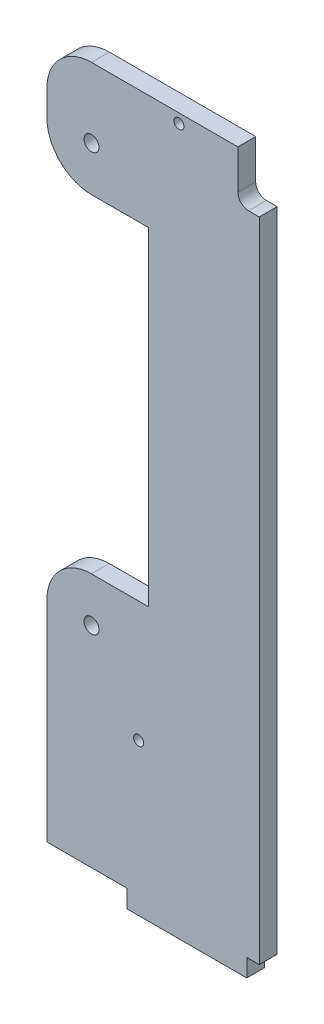
ISO-10303-21;
HEADER;
FILE_DESCRIPTION(('STEP AP214'),'2;1');
FILE_NAME('part.step','',(''),(''),'','','');
FILE_SCHEMA(('AUTOMOTIVE_DESIGN { 1 0 10303 214 1 1 1 1 }'));
ENDSEC;
DATA;
#1=APPLICATION_CONTEXT('core data for automotive mechanical design processes');
#2=APPLICATION_PROTOCOL_DEFINITION('international standard','automotive_design',2000,#1);
#3=PRODUCT_CONTEXT('',#1,'mechanical');
#4=PRODUCT('Part','Part','',(#3));
#5=PRODUCT_RELATED_PRODUCT_CATEGORY('part','',(#4));
#6=PRODUCT_DEFINITION_FORMATION('','',#4);
#7=PRODUCT_DEFINITION_CONTEXT('part definition',#1,'design');
#8=PRODUCT_DEFINITION('design','',#6,#7);
#9=PRODUCT_DEFINITION_SHAPE('','',#8);
#10=(LENGTH_UNIT() NAMED_UNIT(*) SI_UNIT(.MILLI.,.METRE.));
#11=(NAMED_UNIT(*) PLANE_ANGLE_UNIT() SI_UNIT($,.RADIAN.));
#12=(NAMED_UNIT(*) SI_UNIT($,.STERADIAN.) SOLID_ANGLE_UNIT());
#13=UNCERTAINTY_MEASURE_WITH_UNIT(LENGTH_MEASURE(1.E-05),#10,'distance_accuracy_value','');
#14=(GEOMETRIC_REPRESENTATION_CONTEXT(3) GLOBAL_UNCERTAINTY_ASSIGNED_CONTEXT((#13)) GLOBAL_UNIT_ASSIGNED_CONTEXT((#10,
#11,#12)) REPRESENTATION_CONTEXT('',''));
#15=CARTESIAN_POINT('',(0.,0.,0.));
#16=DIRECTION('',(0.,0.,1.));
#17=DIRECTION('',(1.,0.,0.));
#18=AXIS2_PLACEMENT_3D('',#15,#16,#17);
#19=CARTESIAN_POINT('',(44.,125.6,5.));
#20=DIRECTION('',(0.,0.,1.));
#21=DIRECTION('',(1.,0.,0.));
#22=AXIS2_PLACEMENT_3D('',#19,#20,#21);
#23=PLANE('',#22);
#24=CARTESIAN_POINT('',(24.5,134.,5.));
#25=DIRECTION('',(0.,0.,1.));
#26=DIRECTION('',(1.,0.,0.));
#27=AXIS2_PLACEMENT_3D('',#24,#25,#26);
#28=CIRCLE('',#27,1.40000000000001);
#29=CARTESIAN_POINT('',(25.9,134.,5.));
#30=VERTEX_POINT('',#29);
#31=EDGE_CURVE('E366',#30,#30,#28,.T.);
#32=ORIENTED_EDGE('',*,*,#31,.F.);
#33=EDGE_LOOP('',(#32));
#34=FACE_BOUND('',#33,.T.);
#35=CARTESIAN_POINT('',(13.2,-21.3,5.));
#36=DIRECTION('',(0.,0.,1.));
#37=DIRECTION('',(1.,0.,0.));
#38=AXIS2_PLACEMENT_3D('',#35,#36,#37);
#39=CIRCLE('',#38,1.4);
#40=CARTESIAN_POINT('',(14.6,-21.3,5.));
#41=VERTEX_POINT('',#40);
#42=EDGE_CURVE('E368',#41,#41,#39,.T.);
#43=ORIENTED_EDGE('',*,*,#42,.F.);
#44=EDGE_LOOP('',(#43));
#45=FACE_BOUND('',#44,.T.);
#46=CARTESIAN_POINT('',(0.,0.,5.));
#47=DIRECTION('',(0.,0.,1.));
#48=DIRECTION('',(1.,0.,0.));
#49=AXIS2_PLACEMENT_3D('',#46,#47,#48);
#50=CIRCLE('',#49,2.1);
#51=CARTESIAN_POINT('',(2.1,0.,5.));
#52=VERTEX_POINT('',#51);
#53=EDGE_CURVE('E197',#52,#52,#50,.T.);
#54=ORIENTED_EDGE('',*,*,#53,.F.);
#55=EDGE_LOOP('',(#54));
#56=FACE_BOUND('',#55,.T.);
#57=DIRECTION('',(1.,0.,0.));
#58=VECTOR('',#57,1.);
#59=CARTESIAN_POINT('',(43.5,-58.8,5.));
#60=LINE('',#59,#58);
#61=CARTESIAN_POINT('',(43.5,-58.8,5.));
#62=VERTEX_POINT('',#61);
#63=CARTESIAN_POINT('',(47.,-58.8,5.));
#64=VERTEX_POINT('',#63);
#65=EDGE_CURVE('E229',#62,#64,#60,.T.);
#66=ORIENTED_EDGE('',*,*,#65,.T.);
#67=DIRECTION('',(0.,1.,0.));
#68=VECTOR('',#67,1.);
#69=CARTESIAN_POINT('',(47.,-29.8,5.));
#70=LINE('',#69,#68);
#71=CARTESIAN_POINT('',(47.,122.6,5.));
#72=VERTEX_POINT('',#71);
#73=EDGE_CURVE('E126',#64,#72,#70,.T.);
#74=ORIENTED_EDGE('',*,*,#73,.T.);
#75=DIRECTION('',(-1.,0.,0.));
#76=VECTOR('',#75,1.);
#77=CARTESIAN_POINT('',(44.,122.6,5.));
#78=LINE('',#77,#76);
#79=CARTESIAN_POINT('',(44.,122.6,5.));
#80=VERTEX_POINT('',#79);
#81=EDGE_CURVE('E274',#72,#80,#78,.T.);
#82=ORIENTED_EDGE('',*,*,#81,.T.);
#83=CARTESIAN_POINT('',(44.,125.6,5.));
#84=DIRECTION('',(0.,0.,-1.));
#85=DIRECTION('',(1.,0.,0.));
#86=AXIS2_PLACEMENT_3D('',#83,#84,#85);
#87=CIRCLE('',#86,3.);
#88=CARTESIAN_POINT('',(41.,125.6,5.));
#89=VERTEX_POINT('',#88);
#90=EDGE_CURVE('E292',#80,#89,#87,.T.);
#91=ORIENTED_EDGE('',*,*,#90,.T.);
#92=DIRECTION('',(0.,1.,0.));
#93=VECTOR('',#92,1.);
#94=CARTESIAN_POINT('',(41.,136.6,5.));
#95=LINE('',#94,#93);
#96=CARTESIAN_POINT('',(41.,136.6,5.));
#97=VERTEX_POINT('',#96);
#98=EDGE_CURVE('E289',#89,#97,#95,.T.);
#99=ORIENTED_EDGE('',*,*,#98,.T.);
#100=DIRECTION('',(-1.,0.,0.));
#101=VECTOR('',#100,1.);
#102=CARTESIAN_POINT('',(41.,136.6,5.));
#103=LINE('',#102,#101);
#104=CARTESIAN_POINT('',(0.,136.6,5.));
#105=VERTEX_POINT('',#104);
#106=EDGE_CURVE('E291',#97,#105,#103,.T.);
#107=ORIENTED_EDGE('',*,*,#106,.T.);
#108=CARTESIAN_POINT('',(0.,124.1,5.));
#109=DIRECTION('',(0.,0.,1.));
#110=DIRECTION('',(1.,0.,0.));
#111=AXIS2_PLACEMENT_3D('',#108,#109,#110);
#112=CIRCLE('',#111,12.5);
#113=CARTESIAN_POINT('',(-12.5,124.1,5.));
#114=VERTEX_POINT('',#113);
#115=EDGE_CURVE('E294',#105,#114,#112,.T.);
#116=ORIENTED_EDGE('',*,*,#115,.T.);
#117=DIRECTION('',(0.,-1.,0.));
#118=VECTOR('',#117,1.);
#119=CARTESIAN_POINT('',(-12.5,124.1,5.));
#120=LINE('',#119,#118);
#121=CARTESIAN_POINT('',(-12.5,117.,5.));
#122=VERTEX_POINT('',#121);
#123=EDGE_CURVE('E300',#114,#122,#120,.T.);
#124=ORIENTED_EDGE('',*,*,#123,.T.);
#125=CARTESIAN_POINT('',(0.,117.,5.));
#126=DIRECTION('',(0.,0.,1.));
#127=DIRECTION('',(1.,0.,0.));
#128=AXIS2_PLACEMENT_3D('',#125,#126,#127);
#129=CIRCLE('',#128,12.5);
#130=CARTESIAN_POINT('',(0.,104.5,5.));
#131=VERTEX_POINT('',#130);
#132=EDGE_CURVE('E302',#122,#131,#129,.T.);
#133=ORIENTED_EDGE('',*,*,#132,.T.);
#134=DIRECTION('',(1.,0.,0.));
#135=VECTOR('',#134,1.);
#136=CARTESIAN_POINT('',(16.,104.5,5.));
#137=LINE('',#136,#135);
#138=CARTESIAN_POINT('',(16.,104.5,5.));
#139=VERTEX_POINT('',#138);
#140=EDGE_CURVE('E304',#131,#139,#137,.T.);
#141=ORIENTED_EDGE('',*,*,#140,.T.);
#142=DIRECTION('',(0.,-1.,0.));
#143=VECTOR('',#142,1.);
#144=CARTESIAN_POINT('',(16.,12.5,5.));
#145=LINE('',#144,#143);
#146=CARTESIAN_POINT('',(16.,12.5,5.));
#147=VERTEX_POINT('',#146);
#148=EDGE_CURVE('E306',#139,#147,#145,.T.);
#149=ORIENTED_EDGE('',*,*,#148,.T.);
#150=DIRECTION('',(-1.,0.,0.));
#151=VECTOR('',#150,1.);
#152=CARTESIAN_POINT('',(0.,12.5,5.));
#153=LINE('',#152,#151);
#154=CARTESIAN_POINT('',(0.,12.5,5.));
#155=VERTEX_POINT('',#154);
#156=EDGE_CURVE('E308',#147,#155,#153,.T.);
#157=ORIENTED_EDGE('',*,*,#156,.T.);
#158=CARTESIAN_POINT('',(0.,0.,5.));
#159=DIRECTION('',(0.,0.,1.));
#160=DIRECTION('',(1.,0.,0.));
#161=AXIS2_PLACEMENT_3D('',#158,#159,#160);
#162=CIRCLE('',#161,12.5);
#163=CARTESIAN_POINT('',(-12.5,0.,5.));
#164=VERTEX_POINT('',#163);
#165=EDGE_CURVE('E310',#155,#164,#162,.T.);
#166=ORIENTED_EDGE('',*,*,#165,.T.);
#167=DIRECTION('',(0.,-1.,0.));
#168=VECTOR('',#167,1.);
#169=CARTESIAN_POINT('',(-12.5,-58.8,5.));
#170=LINE('',#169,#168);
#171=CARTESIAN_POINT('',(-12.5,-58.8,5.));
#172=VERTEX_POINT('',#171);
#173=EDGE_CURVE('E312',#164,#172,#170,.T.);
#174=ORIENTED_EDGE('',*,*,#173,.T.);
#175=DIRECTION('',(1.,0.,0.));
#176=VECTOR('',#175,1.);
#177=CARTESIAN_POINT('',(10.,-58.8,5.));
#178=LINE('',#177,#176);
#179=CARTESIAN_POINT('',(10.,-58.8,5.));
#180=VERTEX_POINT('',#179);
#181=EDGE_CURVE('E175',#172,#180,#178,.T.);
#182=ORIENTED_EDGE('',*,*,#181,.T.);
#183=DIRECTION('',(0.,-1.,0.));
#184=VECTOR('',#183,1.);
#185=CARTESIAN_POINT('',(10.,-63.8,5.));
#186=LINE('',#185,#184);
#187=CARTESIAN_POINT('',(10.,-63.8,5.));
#188=VERTEX_POINT('',#187);
#189=EDGE_CURVE('E169',#180,#188,#186,.T.);
#190=ORIENTED_EDGE('',*,*,#189,.T.);
#191=DIRECTION('',(1.,0.,0.));
#192=VECTOR('',#191,1.);
#193=CARTESIAN_POINT('',(43.5,-63.8,5.));
#194=LINE('',#193,#192);
#195=CARTESIAN_POINT('',(43.5,-63.8,5.));
#196=VERTEX_POINT('',#195);
#197=EDGE_CURVE('E173',#188,#196,#194,.T.);
#198=ORIENTED_EDGE('',*,*,#197,.T.);
#199=DIRECTION('',(0.,1.,0.));
#200=VECTOR('',#199,1.);
#201=CARTESIAN_POINT('',(43.5,-58.8,5.));
#202=LINE('',#201,#200);
#203=EDGE_CURVE('E53',#196,#62,#202,.T.);
#204=ORIENTED_EDGE('',*,*,#203,.T.);
#205=EDGE_LOOP('',(#66,#74,#82,#91,#99,#107,#116,#124,#133,#141,#149,#157,#166,#174,#182,#190,
#198,#204));
#206=FACE_BOUND('',#205,.T.);
#207=CARTESIAN_POINT('',(0.,117.,5.));
#208=DIRECTION('',(0.,0.,1.));
#209=DIRECTION('',(1.,0.,0.));
#210=AXIS2_PLACEMENT_3D('',#207,#208,#209);
#211=CIRCLE('',#210,2.1);
#212=CARTESIAN_POINT('',(2.1,117.,5.));
#213=VERTEX_POINT('',#212);
#214=EDGE_CURVE('E377',#213,#213,#211,.T.);
#215=ORIENTED_EDGE('',*,*,#214,.F.);
#216=EDGE_LOOP('',(#215));
#217=FACE_BOUND('',#216,.T.);
#218=ADVANCED_FACE('F36',(#34,#45,#56,#206,#217),#23,.T.);
#219=CARTESIAN_POINT('',(44.,125.6,0.));
#220=DIRECTION('',(0.,0.,1.));
#221=DIRECTION('',(1.,0.,0.));
#222=AXIS2_PLACEMENT_3D('',#219,#220,#221);
#223=PLANE('',#222);
#224=CARTESIAN_POINT('',(24.5,134.,0.));
#225=DIRECTION('',(0.,0.,1.));
#226=DIRECTION('',(1.,0.,0.));
#227=AXIS2_PLACEMENT_3D('',#224,#225,#226);
#228=CIRCLE('',#227,1.40000000000001);
#229=CARTESIAN_POINT('',(25.9,134.,0.));
#230=VERTEX_POINT('',#229);
#231=EDGE_CURVE('E364',#230,#230,#228,.T.);
#232=ORIENTED_EDGE('',*,*,#231,.T.);
#233=EDGE_LOOP('',(#232));
#234=FACE_BOUND('',#233,.T.);
#235=CARTESIAN_POINT('',(13.2,-21.3,0.));
#236=DIRECTION('',(0.,0.,1.));
#237=DIRECTION('',(1.,0.,0.));
#238=AXIS2_PLACEMENT_3D('',#235,#236,#237);
#239=CIRCLE('',#238,1.4);
#240=CARTESIAN_POINT('',(14.6,-21.3,0.));
#241=VERTEX_POINT('',#240);
#242=EDGE_CURVE('E371',#241,#241,#239,.T.);
#243=ORIENTED_EDGE('',*,*,#242,.T.);
#244=EDGE_LOOP('',(#243));
#245=FACE_BOUND('',#244,.T.);
#246=DIRECTION('',(1.,0.,0.));
#247=VECTOR('',#246,1.);
#248=CARTESIAN_POINT('',(43.5,-58.8,0.));
#249=LINE('',#248,#247);
#250=CARTESIAN_POINT('',(43.5,-58.8,0.));
#251=VERTEX_POINT('',#250);
#252=CARTESIAN_POINT('',(47.,-58.8,0.));
#253=VERTEX_POINT('',#252);
#254=EDGE_CURVE('E193',#251,#253,#249,.T.);
#255=ORIENTED_EDGE('',*,*,#254,.F.);
#256=DIRECTION('',(0.,1.,0.));
#257=VECTOR('',#256,1.);
#258=CARTESIAN_POINT('',(43.5,-58.8,0.));
#259=LINE('',#258,#257);
#260=CARTESIAN_POINT('',(43.5,-63.8,0.));
#261=VERTEX_POINT('',#260);
#262=EDGE_CURVE('E118',#261,#251,#259,.T.);
#263=ORIENTED_EDGE('',*,*,#262,.F.);
#264=DIRECTION('',(1.,0.,0.));
#265=VECTOR('',#264,1.);
#266=CARTESIAN_POINT('',(43.5,-63.8,0.));
#267=LINE('',#266,#265);
#268=CARTESIAN_POINT('',(10.,-63.8,0.));
#269=VERTEX_POINT('',#268);
#270=EDGE_CURVE('E112',#269,#261,#267,.T.);
#271=ORIENTED_EDGE('',*,*,#270,.F.);
#272=DIRECTION('',(0.,-1.,0.));
#273=VECTOR('',#272,1.);
#274=CARTESIAN_POINT('',(10.,-63.8,0.));
#275=LINE('',#274,#273);
#276=CARTESIAN_POINT('',(10.,-58.8,0.));
#277=VERTEX_POINT('',#276);
#278=EDGE_CURVE('E183',#277,#269,#275,.T.);
#279=ORIENTED_EDGE('',*,*,#278,.F.);
#280=DIRECTION('',(1.,0.,0.));
#281=VECTOR('',#280,1.);
#282=CARTESIAN_POINT('',(10.,-58.8,0.));
#283=LINE('',#282,#281);
#284=CARTESIAN_POINT('',(-12.5,-58.8,0.));
#285=VERTEX_POINT('',#284);
#286=EDGE_CURVE('E224',#285,#277,#283,.T.);
#287=ORIENTED_EDGE('',*,*,#286,.F.);
#288=DIRECTION('',(0.,-1.,0.));
#289=VECTOR('',#288,1.);
#290=CARTESIAN_POINT('',(-12.5,-58.8,0.));
#291=LINE('',#290,#289);
#292=CARTESIAN_POINT('',(-12.5,0.,0.));
#293=VERTEX_POINT('',#292);
#294=EDGE_CURVE('E222',#293,#285,#291,.T.);
#295=ORIENTED_EDGE('',*,*,#294,.F.);
#296=CARTESIAN_POINT('',(0.,0.,0.));
#297=DIRECTION('',(0.,0.,1.));
#298=DIRECTION('',(1.,0.,0.));
#299=AXIS2_PLACEMENT_3D('',#296,#297,#298);
#300=CIRCLE('',#299,12.5);
#301=CARTESIAN_POINT('',(0.,12.5,0.));
#302=VERTEX_POINT('',#301);
#303=EDGE_CURVE('E220',#302,#293,#300,.T.);
#304=ORIENTED_EDGE('',*,*,#303,.F.);
#305=DIRECTION('',(-1.,0.,0.));
#306=VECTOR('',#305,1.);
#307=CARTESIAN_POINT('',(0.,12.5,0.));
#308=LINE('',#307,#306);
#309=CARTESIAN_POINT('',(16.,12.5,0.));
#310=VERTEX_POINT('',#309);
#311=EDGE_CURVE('E218',#310,#302,#308,.T.);
#312=ORIENTED_EDGE('',*,*,#311,.F.);
#313=DIRECTION('',(0.,-1.,0.));
#314=VECTOR('',#313,1.);
#315=CARTESIAN_POINT('',(16.,12.5,0.));
#316=LINE('',#315,#314);
#317=CARTESIAN_POINT('',(16.,104.5,0.));
#318=VERTEX_POINT('',#317);
#319=EDGE_CURVE('E216',#318,#310,#316,.T.);
#320=ORIENTED_EDGE('',*,*,#319,.F.);
#321=DIRECTION('',(1.,0.,0.));
#322=VECTOR('',#321,1.);
#323=CARTESIAN_POINT('',(16.,104.5,0.));
#324=LINE('',#323,#322);
#325=CARTESIAN_POINT('',(0.,104.5,0.));
#326=VERTEX_POINT('',#325);
#327=EDGE_CURVE('E214',#326,#318,#324,.T.);
#328=ORIENTED_EDGE('',*,*,#327,.F.);
#329=CARTESIAN_POINT('',(0.,117.,0.));
#330=DIRECTION('',(0.,0.,1.));
#331=DIRECTION('',(1.,0.,0.));
#332=AXIS2_PLACEMENT_3D('',#329,#330,#331);
#333=CIRCLE('',#332,12.5);
#334=CARTESIAN_POINT('',(-12.5,117.,0.));
#335=VERTEX_POINT('',#334);
#336=EDGE_CURVE('E212',#335,#326,#333,.T.);
#337=ORIENTED_EDGE('',*,*,#336,.F.);
#338=DIRECTION('',(0.,-1.,0.));
#339=VECTOR('',#338,1.);
#340=CARTESIAN_POINT('',(-12.5,124.1,0.));
#341=LINE('',#340,#339);
#342=CARTESIAN_POINT('',(-12.5,124.1,0.));
#343=VERTEX_POINT('',#342);
#344=EDGE_CURVE('E210',#343,#335,#341,.T.);
#345=ORIENTED_EDGE('',*,*,#344,.F.);
#346=CARTESIAN_POINT('',(0.,124.1,0.));
#347=DIRECTION('',(0.,0.,1.));
#348=DIRECTION('',(1.,0.,0.));
#349=AXIS2_PLACEMENT_3D('',#346,#347,#348);
#350=CIRCLE('',#349,12.5);
#351=CARTESIAN_POINT('',(0.,136.6,0.));
#352=VERTEX_POINT('',#351);
#353=EDGE_CURVE('E208',#352,#343,#350,.T.);
#354=ORIENTED_EDGE('',*,*,#353,.F.);
#355=DIRECTION('',(-1.,0.,0.));
#356=VECTOR('',#355,1.);
#357=CARTESIAN_POINT('',(0.,136.6,0.));
#358=LINE('',#357,#356);
#359=CARTESIAN_POINT('',(41.,136.6,0.));
#360=VERTEX_POINT('',#359);
#361=EDGE_CURVE('E206',#360,#352,#358,.T.);
#362=ORIENTED_EDGE('',*,*,#361,.F.);
#363=DIRECTION('',(0.,1.,0.));
#364=VECTOR('',#363,1.);
#365=CARTESIAN_POINT('',(41.,136.6,0.));
#366=LINE('',#365,#364);
#367=CARTESIAN_POINT('',(41.,125.6,0.));
#368=VERTEX_POINT('',#367);
#369=EDGE_CURVE('E203',#368,#360,#366,.T.);
#370=ORIENTED_EDGE('',*,*,#369,.F.);
#371=CARTESIAN_POINT('',(44.,125.6,0.));
#372=DIRECTION('',(0.,0.,-1.));
#373=DIRECTION('',(1.,0.,0.));
#374=AXIS2_PLACEMENT_3D('',#371,#372,#373);
#375=CIRCLE('',#374,3.);
#376=CARTESIAN_POINT('',(44.,122.6,0.));
#377=VERTEX_POINT('',#376);
#378=EDGE_CURVE('E201',#377,#368,#375,.T.);
#379=ORIENTED_EDGE('',*,*,#378,.F.);
#380=DIRECTION('',(-1.,0.,0.));
#381=VECTOR('',#380,1.);
#382=CARTESIAN_POINT('',(44.,122.6,0.));
#383=LINE('',#382,#381);
#384=CARTESIAN_POINT('',(47.,122.6,0.));
#385=VERTEX_POINT('',#384);
#386=EDGE_CURVE('E199',#385,#377,#383,.T.);
#387=ORIENTED_EDGE('',*,*,#386,.F.);
#388=DIRECTION('',(0.,1.,0.));
#389=VECTOR('',#388,1.);
#390=CARTESIAN_POINT('',(47.,122.6,0.));
#391=LINE('',#390,#389);
#392=EDGE_CURVE('E196',#253,#385,#391,.T.);
#393=ORIENTED_EDGE('',*,*,#392,.F.);
#394=EDGE_LOOP('',(#255,#263,#271,#279,#287,#295,#304,#312,#320,#328,#337,#345,#354,#362,#370,
#379,#387,#393));
#395=FACE_BOUND('',#394,.T.);
#396=CARTESIAN_POINT('',(0.,0.,0.));
#397=DIRECTION('',(0.,0.,1.));
#398=DIRECTION('',(1.,0.,0.));
#399=AXIS2_PLACEMENT_3D('',#396,#397,#398);
#400=CIRCLE('',#399,2.1);
#401=CARTESIAN_POINT('',(2.1,0.,0.));
#402=VERTEX_POINT('',#401);
#403=EDGE_CURVE('E380',#402,#402,#400,.T.);
#404=ORIENTED_EDGE('',*,*,#403,.T.);
#405=EDGE_LOOP('',(#404));
#406=FACE_BOUND('',#405,.T.);
#407=CARTESIAN_POINT('',(0.,117.,0.));
#408=DIRECTION('',(0.,0.,1.));
#409=DIRECTION('',(1.,0.,0.));
#410=AXIS2_PLACEMENT_3D('',#407,#408,#409);
#411=CIRCLE('',#410,2.1);
#412=CARTESIAN_POINT('',(2.1,117.,0.));
#413=VERTEX_POINT('',#412);
#414=EDGE_CURVE('E374',#413,#413,#411,.T.);
#415=ORIENTED_EDGE('',*,*,#414,.T.);
#416=EDGE_LOOP('',(#415));
#417=FACE_BOUND('',#416,.T.);
#418=ADVANCED_FACE('F278',(#234,#245,#395,#406,#417),#223,.F.);
#419=CARTESIAN_POINT('',(43.5,-58.8,5.));
#420=DIRECTION('',(0.,1.,0.));
#421=DIRECTION('',(0.,0.,1.));
#422=AXIS2_PLACEMENT_3D('',#419,#420,#421);
#423=PLANE('',#422);
#424=ORIENTED_EDGE('',*,*,#254,.T.);
#425=DIRECTION('',(0.,0.,-1.));
#426=VECTOR('',#425,1.);
#427=CARTESIAN_POINT('',(47.,-58.8,5.));
#428=LINE('',#427,#426);
#429=EDGE_CURVE('E11',#64,#253,#428,.T.);
#430=ORIENTED_EDGE('',*,*,#429,.F.);
#431=ORIENTED_EDGE('',*,*,#65,.F.);
#432=DIRECTION('',(0.,0.,-1.));
#433=VECTOR('',#432,1.);
#434=CARTESIAN_POINT('',(43.5,-58.8,5.));
#435=LINE('',#434,#433);
#436=EDGE_CURVE('E189',#62,#251,#435,.T.);
#437=ORIENTED_EDGE('',*,*,#436,.T.);
#438=EDGE_LOOP('',(#424,#430,#431,#437));
#439=FACE_BOUND('',#438,.T.);
#440=ADVANCED_FACE('F38',(#439),#423,.F.);
#441=CARTESIAN_POINT('',(47.,122.6,5.));
#442=DIRECTION('',(-1.,0.,0.));
#443=DIRECTION('',(0.,-1.,0.));
#444=AXIS2_PLACEMENT_3D('',#441,#442,#443);
#445=PLANE('',#444);
#446=ORIENTED_EDGE('',*,*,#392,.T.);
#447=DIRECTION('',(0.,0.,-1.));
#448=VECTOR('',#447,1.);
#449=CARTESIAN_POINT('',(47.,122.6,5.));
#450=LINE('',#449,#448);
#451=EDGE_CURVE('E45',#72,#385,#450,.T.);
#452=ORIENTED_EDGE('',*,*,#451,.F.);
#453=ORIENTED_EDGE('',*,*,#73,.F.);
#454=ORIENTED_EDGE('',*,*,#429,.T.);
#455=EDGE_LOOP('',(#446,#452,#453,#454));
#456=FACE_BOUND('',#455,.T.);
#457=ADVANCED_FACE('F553',(#456),#445,.F.);
#458=CARTESIAN_POINT('',(44.,122.6,5.));
#459=DIRECTION('',(0.,-1.,0.));
#460=DIRECTION('',(1.,0.,0.));
#461=AXIS2_PLACEMENT_3D('',#458,#459,#460);
#462=PLANE('',#461);
#463=ORIENTED_EDGE('',*,*,#386,.T.);
#464=DIRECTION('',(0.,0.,-1.));
#465=VECTOR('',#464,1.);
#466=CARTESIAN_POINT('',(44.,122.6,5.));
#467=LINE('',#466,#465);
#468=EDGE_CURVE('E266',#80,#377,#467,.T.);
#469=ORIENTED_EDGE('',*,*,#468,.F.);
#470=ORIENTED_EDGE('',*,*,#81,.F.);
#471=ORIENTED_EDGE('',*,*,#451,.T.);
#472=EDGE_LOOP('',(#463,#469,#470,#471));
#473=FACE_BOUND('',#472,.T.);
#474=ADVANCED_FACE('F272',(#473),#462,.F.);
#475=CARTESIAN_POINT('',(44.,125.6,5.));
#476=DIRECTION('',(0.,0.,-1.));
#477=DIRECTION('',(-1.,0.,0.));
#478=AXIS2_PLACEMENT_3D('',#475,#476,#477);
#479=CYLINDRICAL_SURFACE('',#478,3.);
#480=ORIENTED_EDGE('',*,*,#378,.T.);
#481=DIRECTION('',(0.,0.,-1.));
#482=VECTOR('',#481,1.);
#483=CARTESIAN_POINT('',(41.,125.6,5.));
#484=LINE('',#483,#482);
#485=EDGE_CURVE('E263',#89,#368,#484,.T.);
#486=ORIENTED_EDGE('',*,*,#485,.F.);
#487=ORIENTED_EDGE('',*,*,#90,.F.);
#488=ORIENTED_EDGE('',*,*,#468,.T.);
#489=EDGE_LOOP('',(#480,#486,#487,#488));
#490=FACE_BOUND('',#489,.T.);
#491=ADVANCED_FACE('F283',(#490),#479,.F.);
#492=CARTESIAN_POINT('',(41.,136.6,5.));
#493=DIRECTION('',(-1.,0.,0.));
#494=DIRECTION('',(0.,0.,1.));
#495=AXIS2_PLACEMENT_3D('',#492,#493,#494);
#496=PLANE('',#495);
#497=ORIENTED_EDGE('',*,*,#369,.T.);
#498=DIRECTION('',(0.,0.,-1.));
#499=VECTOR('',#498,1.);
#500=CARTESIAN_POINT('',(41.,136.6,5.));
#501=LINE('',#500,#499);
#502=EDGE_CURVE('E260',#97,#360,#501,.T.);
#503=ORIENTED_EDGE('',*,*,#502,.F.);
#504=ORIENTED_EDGE('',*,*,#98,.F.);
#505=ORIENTED_EDGE('',*,*,#485,.T.);
#506=EDGE_LOOP('',(#497,#503,#504,#505));
#507=FACE_BOUND('',#506,.T.);
#508=ADVANCED_FACE('F287',(#507),#496,.F.);
#509=CARTESIAN_POINT('',(0.,136.6,5.));
#510=DIRECTION('',(0.,-1.,0.));
#511=DIRECTION('',(0.,0.,-1.));
#512=AXIS2_PLACEMENT_3D('',#509,#510,#511);
#513=PLANE('',#512);
#514=ORIENTED_EDGE('',*,*,#361,.T.);
#515=DIRECTION('',(0.,0.,-1.));
#516=VECTOR('',#515,1.);
#517=CARTESIAN_POINT('',(0.,136.6,5.));
#518=LINE('',#517,#516);
#519=EDGE_CURVE('E257',#105,#352,#518,.T.);
#520=ORIENTED_EDGE('',*,*,#519,.F.);
#521=ORIENTED_EDGE('',*,*,#106,.F.);
#522=ORIENTED_EDGE('',*,*,#502,.T.);
#523=EDGE_LOOP('',(#514,#520,#521,#522));
#524=FACE_BOUND('',#523,.T.);
#525=ADVANCED_FACE('F517',(#524),#513,.F.);
#526=CARTESIAN_POINT('',(0.,124.1,5.));
#527=DIRECTION('',(0.,0.,-1.));
#528=DIRECTION('',(-1.,0.,0.));
#529=AXIS2_PLACEMENT_3D('',#526,#527,#528);
#530=CYLINDRICAL_SURFACE('',#529,12.5);
#531=ORIENTED_EDGE('',*,*,#353,.T.);
#532=DIRECTION('',(0.,0.,-1.));
#533=VECTOR('',#532,1.);
#534=CARTESIAN_POINT('',(-12.5,124.1,5.));
#535=LINE('',#534,#533);
#536=EDGE_CURVE('E254',#114,#343,#535,.T.);
#537=ORIENTED_EDGE('',*,*,#536,.F.);
#538=ORIENTED_EDGE('',*,*,#115,.F.);
#539=ORIENTED_EDGE('',*,*,#519,.T.);
#540=EDGE_LOOP('',(#531,#537,#538,#539));
#541=FACE_BOUND('',#540,.T.);
#542=ADVANCED_FACE('F507',(#541),#530,.T.);
#543=CARTESIAN_POINT('',(-12.5,124.1,5.));
#544=DIRECTION('',(1.,0.,0.));
#545=DIRECTION('',(0.,1.,0.));
#546=AXIS2_PLACEMENT_3D('',#543,#544,#545);
#547=PLANE('',#546);
#548=ORIENTED_EDGE('',*,*,#344,.T.);
#549=DIRECTION('',(0.,0.,-1.));
#550=VECTOR('',#549,1.);
#551=CARTESIAN_POINT('',(-12.5,117.,5.));
#552=LINE('',#551,#550);
#553=EDGE_CURVE('E251',#122,#335,#552,.T.);
#554=ORIENTED_EDGE('',*,*,#553,.F.);
#555=ORIENTED_EDGE('',*,*,#123,.F.);
#556=ORIENTED_EDGE('',*,*,#536,.T.);
#557=EDGE_LOOP('',(#548,#554,#555,#556));
#558=FACE_BOUND('',#557,.T.);
#559=ADVANCED_FACE('F497',(#558),#547,.F.);
#560=CARTESIAN_POINT('',(0.,117.,5.));
#561=DIRECTION('',(0.,0.,-1.));
#562=DIRECTION('',(-1.,0.,0.));
#563=AXIS2_PLACEMENT_3D('',#560,#561,#562);
#564=CYLINDRICAL_SURFACE('',#563,12.5);
#565=ORIENTED_EDGE('',*,*,#336,.T.);
#566=DIRECTION('',(0.,0.,-1.));
#567=VECTOR('',#566,1.);
#568=CARTESIAN_POINT('',(0.,104.5,5.));
#569=LINE('',#568,#567);
#570=EDGE_CURVE('E248',#131,#326,#569,.T.);
#571=ORIENTED_EDGE('',*,*,#570,.F.);
#572=ORIENTED_EDGE('',*,*,#132,.F.);
#573=ORIENTED_EDGE('',*,*,#553,.T.);
#574=EDGE_LOOP('',(#565,#571,#572,#573));
#575=FACE_BOUND('',#574,.T.);
#576=ADVANCED_FACE('F487',(#575),#564,.T.);
#577=CARTESIAN_POINT('',(16.,104.5,5.));
#578=DIRECTION('',(0.,1.,0.));
#579=DIRECTION('',(-1.,0.,0.));
#580=AXIS2_PLACEMENT_3D('',#577,#578,#579);
#581=PLANE('',#580);
#582=ORIENTED_EDGE('',*,*,#327,.T.);
#583=DIRECTION('',(0.,0.,-1.));
#584=VECTOR('',#583,1.);
#585=CARTESIAN_POINT('',(16.,104.5,5.));
#586=LINE('',#585,#584);
#587=EDGE_CURVE('E245',#139,#318,#586,.T.);
#588=ORIENTED_EDGE('',*,*,#587,.F.);
#589=ORIENTED_EDGE('',*,*,#140,.F.);
#590=ORIENTED_EDGE('',*,*,#570,.T.);
#591=EDGE_LOOP('',(#582,#588,#589,#590));
#592=FACE_BOUND('',#591,.T.);
#593=ADVANCED_FACE('F477',(#592),#581,.F.);
#594=CARTESIAN_POINT('',(16.,12.5,5.));
#595=DIRECTION('',(1.,0.,0.));
#596=DIRECTION('',(0.,0.,-1.));
#597=AXIS2_PLACEMENT_3D('',#594,#595,#596);
#598=PLANE('',#597);
#599=ORIENTED_EDGE('',*,*,#319,.T.);
#600=DIRECTION('',(0.,0.,-1.));
#601=VECTOR('',#600,1.);
#602=CARTESIAN_POINT('',(16.,12.5,5.));
#603=LINE('',#602,#601);
#604=EDGE_CURVE('E242',#147,#310,#603,.T.);
#605=ORIENTED_EDGE('',*,*,#604,.F.);
#606=ORIENTED_EDGE('',*,*,#148,.F.);
#607=ORIENTED_EDGE('',*,*,#587,.T.);
#608=EDGE_LOOP('',(#599,#605,#606,#607));
#609=FACE_BOUND('',#608,.T.);
#610=ADVANCED_FACE('F467',(#609),#598,.F.);
#611=CARTESIAN_POINT('',(0.,12.5,5.));
#612=DIRECTION('',(0.,-1.,0.));
#613=DIRECTION('',(1.,0.,0.));
#614=AXIS2_PLACEMENT_3D('',#611,#612,#613);
#615=PLANE('',#614);
#616=ORIENTED_EDGE('',*,*,#311,.T.);
#617=DIRECTION('',(0.,0.,-1.));
#618=VECTOR('',#617,1.);
#619=CARTESIAN_POINT('',(0.,12.5,5.));
#620=LINE('',#619,#618);
#621=EDGE_CURVE('E239',#155,#302,#620,.T.);
#622=ORIENTED_EDGE('',*,*,#621,.F.);
#623=ORIENTED_EDGE('',*,*,#156,.F.);
#624=ORIENTED_EDGE('',*,*,#604,.T.);
#625=EDGE_LOOP('',(#616,#622,#623,#624));
#626=FACE_BOUND('',#625,.T.);
#627=ADVANCED_FACE('F457',(#626),#615,.F.);
#628=CARTESIAN_POINT('',(0.,0.,5.));
#629=DIRECTION('',(0.,0.,-1.));
#630=DIRECTION('',(-1.,0.,0.));
#631=AXIS2_PLACEMENT_3D('',#628,#629,#630);
#632=CYLINDRICAL_SURFACE('',#631,12.5);
#633=ORIENTED_EDGE('',*,*,#303,.T.);
#634=DIRECTION('',(0.,0.,-1.));
#635=VECTOR('',#634,1.);
#636=CARTESIAN_POINT('',(-12.5,0.,5.));
#637=LINE('',#636,#635);
#638=EDGE_CURVE('E236',#164,#293,#637,.T.);
#639=ORIENTED_EDGE('',*,*,#638,.F.);
#640=ORIENTED_EDGE('',*,*,#165,.F.);
#641=ORIENTED_EDGE('',*,*,#621,.T.);
#642=EDGE_LOOP('',(#633,#639,#640,#641));
#643=FACE_BOUND('',#642,.T.);
#644=ADVANCED_FACE('F448',(#643),#632,.T.);
#645=CARTESIAN_POINT('',(-12.5,-58.8,5.));
#646=DIRECTION('',(1.,0.,0.));
#647=DIRECTION('',(0.,1.,0.));
#648=AXIS2_PLACEMENT_3D('',#645,#646,#647);
#649=PLANE('',#648);
#650=ORIENTED_EDGE('',*,*,#294,.T.);
#651=DIRECTION('',(0.,0.,-1.));
#652=VECTOR('',#651,1.);
#653=CARTESIAN_POINT('',(-12.5,-58.8,5.));
#654=LINE('',#653,#652);
#655=EDGE_CURVE('E233',#172,#285,#654,.T.);
#656=ORIENTED_EDGE('',*,*,#655,.F.);
#657=ORIENTED_EDGE('',*,*,#173,.F.);
#658=ORIENTED_EDGE('',*,*,#638,.T.);
#659=EDGE_LOOP('',(#650,#656,#657,#658));
#660=FACE_BOUND('',#659,.T.);
#661=ADVANCED_FACE('F318',(#660),#649,.F.);
#662=CARTESIAN_POINT('',(10.,-58.8,5.));
#663=DIRECTION('',(0.,1.,0.));
#664=DIRECTION('',(0.,0.,1.));
#665=AXIS2_PLACEMENT_3D('',#662,#663,#664);
#666=PLANE('',#665);
#667=ORIENTED_EDGE('',*,*,#286,.T.);
#668=DIRECTION('',(0.,0.,-1.));
#669=VECTOR('',#668,1.);
#670=CARTESIAN_POINT('',(10.,-58.8,5.));
#671=LINE('',#670,#669);
#672=EDGE_CURVE('E184',#180,#277,#671,.T.);
#673=ORIENTED_EDGE('',*,*,#672,.F.);
#674=ORIENTED_EDGE('',*,*,#181,.F.);
#675=ORIENTED_EDGE('',*,*,#655,.T.);
#676=EDGE_LOOP('',(#667,#673,#674,#675));
#677=FACE_BOUND('',#676,.T.);
#678=ADVANCED_FACE('F322',(#677),#666,.F.);
#679=CARTESIAN_POINT('',(10.,-63.8,5.));
#680=DIRECTION('',(1.,0.,0.));
#681=DIRECTION('',(0.,0.,-1.));
#682=AXIS2_PLACEMENT_3D('',#679,#680,#681);
#683=PLANE('',#682);
#684=ORIENTED_EDGE('',*,*,#278,.T.);
#685=DIRECTION('',(0.,0.,-1.));
#686=VECTOR('',#685,1.);
#687=CARTESIAN_POINT('',(10.,-63.8,5.));
#688=LINE('',#687,#686);
#689=EDGE_CURVE('E180',#188,#269,#688,.T.);
#690=ORIENTED_EDGE('',*,*,#689,.F.);
#691=ORIENTED_EDGE('',*,*,#189,.F.);
#692=ORIENTED_EDGE('',*,*,#672,.T.);
#693=EDGE_LOOP('',(#684,#690,#691,#692));
#694=FACE_BOUND('',#693,.T.);
#695=ADVANCED_FACE('F181',(#694),#683,.F.);
#696=CARTESIAN_POINT('',(43.5,-63.8,5.));
#697=DIRECTION('',(0.,1.,0.));
#698=DIRECTION('',(0.,0.,1.));
#699=AXIS2_PLACEMENT_3D('',#696,#697,#698);
#700=PLANE('',#699);
#701=ORIENTED_EDGE('',*,*,#270,.T.);
#702=DIRECTION('',(0.,0.,-1.));
#703=VECTOR('',#702,1.);
#704=CARTESIAN_POINT('',(43.5,-63.8,5.));
#705=LINE('',#704,#703);
#706=EDGE_CURVE('E185',#196,#261,#705,.T.);
#707=ORIENTED_EDGE('',*,*,#706,.F.);
#708=ORIENTED_EDGE('',*,*,#197,.F.);
#709=ORIENTED_EDGE('',*,*,#689,.T.);
#710=EDGE_LOOP('',(#701,#707,#708,#709));
#711=FACE_BOUND('',#710,.T.);
#712=ADVANCED_FACE('F187',(#711),#700,.F.);
#713=CARTESIAN_POINT('',(43.5,-58.8,5.));
#714=DIRECTION('',(-1.,0.,0.));
#715=DIRECTION('',(0.,0.,1.));
#716=AXIS2_PLACEMENT_3D('',#713,#714,#715);
#717=PLANE('',#716);
#718=ORIENTED_EDGE('',*,*,#262,.T.);
#719=ORIENTED_EDGE('',*,*,#436,.F.);
#720=ORIENTED_EDGE('',*,*,#203,.F.);
#721=ORIENTED_EDGE('',*,*,#706,.T.);
#722=EDGE_LOOP('',(#718,#719,#720,#721));
#723=FACE_BOUND('',#722,.T.);
#724=ADVANCED_FACE('F326',(#723),#717,.F.);
#725=CARTESIAN_POINT('',(0.,0.,5.));
#726=DIRECTION('',(0.,0.,-1.));
#727=DIRECTION('',(-1.,0.,0.));
#728=AXIS2_PLACEMENT_3D('',#725,#726,#727);
#729=CYLINDRICAL_SURFACE('',#728,2.1);
#730=ORIENTED_EDGE('',*,*,#53,.T.);
#731=EDGE_LOOP('',(#730));
#732=FACE_BOUND('',#731,.T.);
#733=ORIENTED_EDGE('',*,*,#403,.F.);
#734=EDGE_LOOP('',(#733));
#735=FACE_BOUND('',#734,.T.);
#736=ADVANCED_FACE('F328',(#732,#735),#729,.F.);
#737=CARTESIAN_POINT('',(0.,117.,5.));
#738=DIRECTION('',(0.,0.,-1.));
#739=DIRECTION('',(-1.,0.,0.));
#740=AXIS2_PLACEMENT_3D('',#737,#738,#739);
#741=CYLINDRICAL_SURFACE('',#740,2.1);
#742=ORIENTED_EDGE('',*,*,#214,.T.);
#743=EDGE_LOOP('',(#742));
#744=FACE_BOUND('',#743,.T.);
#745=ORIENTED_EDGE('',*,*,#414,.F.);
#746=EDGE_LOOP('',(#745));
#747=FACE_BOUND('',#746,.T.);
#748=ADVANCED_FACE('F334',(#744,#747),#741,.F.);
#749=CARTESIAN_POINT('',(13.2,-21.3,0.));
#750=DIRECTION('',(0.,0.,1.));
#751=DIRECTION('',(1.,0.,0.));
#752=AXIS2_PLACEMENT_3D('',#749,#750,#751);
#753=CYLINDRICAL_SURFACE('',#752,1.4);
#754=ORIENTED_EDGE('',*,*,#242,.F.);
#755=EDGE_LOOP('',(#754));
#756=FACE_BOUND('',#755,.T.);
#757=ORIENTED_EDGE('',*,*,#42,.T.);
#758=EDGE_LOOP('',(#757));
#759=FACE_BOUND('',#758,.T.);
#760=ADVANCED_FACE('F351',(#756,#759),#753,.F.);
#761=CARTESIAN_POINT('',(24.5,134.,0.));
#762=DIRECTION('',(0.,0.,1.));
#763=DIRECTION('',(1.,0.,0.));
#764=AXIS2_PLACEMENT_3D('',#761,#762,#763);
#765=CYLINDRICAL_SURFACE('',#764,1.40000000000001);
#766=ORIENTED_EDGE('',*,*,#231,.F.);
#767=EDGE_LOOP('',(#766));
#768=FACE_BOUND('',#767,.T.);
#769=ORIENTED_EDGE('',*,*,#31,.T.);
#770=EDGE_LOOP('',(#769));
#771=FACE_BOUND('',#770,.T.);
#772=ADVANCED_FACE('F355',(#768,#771),#765,.F.);
#773=CLOSED_SHELL('',(#218,#418,#440,#457,#474,#491,#508,#525,#542,#559,#576,#593,#610,#627,
#644,#661,#678,#695,#712,#724,#736,#748,#760,#772));
#774=MANIFOLD_SOLID_BREP('B2',#773);
#775=ADVANCED_BREP_SHAPE_REPRESENTATION('',(#18,#774),#14);
#776=SHAPE_DEFINITION_REPRESENTATION(#9,#775);
ENDSEC;
END-ISO-10303-21;
